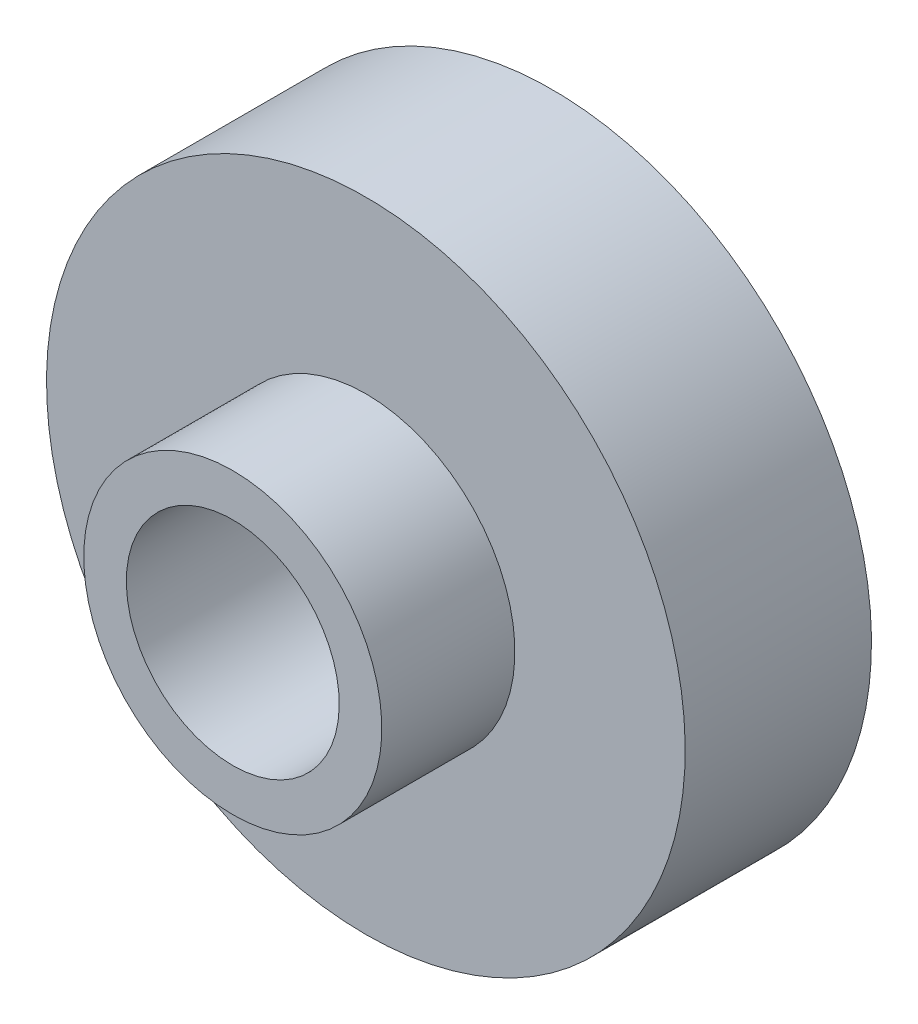
ISO-10303-21;
HEADER;
FILE_DESCRIPTION(('STEP AP214'),'2;1');
FILE_NAME('part.step','',(''),(''),'','','');
FILE_SCHEMA(('AUTOMOTIVE_DESIGN { 1 0 10303 214 1 1 1 1 }'));
ENDSEC;
DATA;
#1=APPLICATION_CONTEXT('core data for automotive mechanical design processes');
#2=APPLICATION_PROTOCOL_DEFINITION('international standard','automotive_design',2000,#1);
#3=PRODUCT_CONTEXT('',#1,'mechanical');
#4=PRODUCT('Part','Part','',(#3));
#5=PRODUCT_RELATED_PRODUCT_CATEGORY('part','',(#4));
#6=PRODUCT_DEFINITION_FORMATION('','',#4);
#7=PRODUCT_DEFINITION_CONTEXT('part definition',#1,'design');
#8=PRODUCT_DEFINITION('design','',#6,#7);
#9=PRODUCT_DEFINITION_SHAPE('','',#8);
#10=(LENGTH_UNIT() NAMED_UNIT(*) SI_UNIT(.MILLI.,.METRE.));
#11=(NAMED_UNIT(*) PLANE_ANGLE_UNIT() SI_UNIT($,.RADIAN.));
#12=(NAMED_UNIT(*) SI_UNIT($,.STERADIAN.) SOLID_ANGLE_UNIT());
#13=UNCERTAINTY_MEASURE_WITH_UNIT(LENGTH_MEASURE(1.E-05),#10,'distance_accuracy_value','');
#14=(GEOMETRIC_REPRESENTATION_CONTEXT(3) GLOBAL_UNCERTAINTY_ASSIGNED_CONTEXT((#13)) GLOBAL_UNIT_ASSIGNED_CONTEXT((#10,
#11,#12)) REPRESENTATION_CONTEXT('',''));
#15=CARTESIAN_POINT('',(0.,0.,0.));
#16=DIRECTION('',(0.,0.,1.));
#17=DIRECTION('',(1.,0.,0.));
#18=AXIS2_PLACEMENT_3D('',#15,#16,#17);
#19=CARTESIAN_POINT('',(0.,0.,152.4));
#20=DIRECTION('',(0.,0.,1.));
#21=DIRECTION('',(0.,-1.,0.));
#22=AXIS2_PLACEMENT_3D('',#19,#20,#21);
#23=CYLINDRICAL_SURFACE('',#22,50.8000000000002);
#24=CARTESIAN_POINT('',(0.,0.,66.0400000000002));
#25=DIRECTION('',(0.,0.,1.));
#26=DIRECTION('',(0.,-1.,0.));
#27=AXIS2_PLACEMENT_3D('',#24,#25,#26);
#28=CIRCLE('',#27,50.8000000000002);
#29=CARTESIAN_POINT('',(0.,-50.8000000000002,66.0400000000002));
#30=VERTEX_POINT('',#29);
#31=EDGE_CURVE('E10',#30,#30,#28,.T.);
#32=ORIENTED_EDGE('',*,*,#31,.F.);
#33=EDGE_LOOP('',(#32));
#34=FACE_BOUND('',#33,.T.);
#35=CARTESIAN_POINT('',(0.,0.,152.4));
#36=DIRECTION('',(0.,0.,1.));
#37=DIRECTION('',(0.,-1.,0.));
#38=AXIS2_PLACEMENT_3D('',#35,#36,#37);
#39=CIRCLE('',#38,50.8000000000002);
#40=CARTESIAN_POINT('',(0.,-50.8000000000002,152.4));
#41=VERTEX_POINT('',#40);
#42=EDGE_CURVE('E86',#41,#41,#39,.T.);
#43=ORIENTED_EDGE('',*,*,#42,.T.);
#44=EDGE_LOOP('',(#43));
#45=FACE_BOUND('',#44,.T.);
#46=ADVANCED_FACE('F33',(#34,#45),#23,.F.);
#47=CARTESIAN_POINT('',(0.,50.8000000000002,66.0400000000002));
#48=DIRECTION('',(0.,0.,1.));
#49=DIRECTION('',(0.,-1.,0.));
#50=AXIS2_PLACEMENT_3D('',#47,#48,#49);
#51=PLANE('',#50);
#52=CARTESIAN_POINT('',(0.,0.,66.0400000000002));
#53=DIRECTION('',(0.,0.,1.));
#54=DIRECTION('',(0.,-1.,0.));
#55=AXIS2_PLACEMENT_3D('',#52,#53,#54);
#56=CIRCLE('',#55,63.5000000000001);
#57=CARTESIAN_POINT('',(0.,-63.5000000000001,66.0400000000002));
#58=VERTEX_POINT('',#57);
#59=EDGE_CURVE('E40',#58,#58,#56,.T.);
#60=ORIENTED_EDGE('',*,*,#59,.F.);
#61=EDGE_LOOP('',(#60));
#62=FACE_BOUND('',#61,.T.);
#63=ORIENTED_EDGE('',*,*,#31,.T.);
#64=EDGE_LOOP('',(#63));
#65=FACE_BOUND('',#64,.T.);
#66=ADVANCED_FACE('F149',(#62,#65),#51,.F.);
#67=CARTESIAN_POINT('',(0.,0.,152.4));
#68=DIRECTION('',(0.,0.,1.));
#69=DIRECTION('',(0.,-1.,0.));
#70=AXIS2_PLACEMENT_3D('',#67,#68,#69);
#71=CYLINDRICAL_SURFACE('',#70,63.5000000000001);
#72=CARTESIAN_POINT('',(0.,0.,40.6400000000002));
#73=DIRECTION('',(0.,0.,1.));
#74=DIRECTION('',(0.,-1.,0.));
#75=AXIS2_PLACEMENT_3D('',#72,#73,#74);
#76=CIRCLE('',#75,63.5000000000001);
#77=CARTESIAN_POINT('',(0.,-63.5000000000001,40.6400000000002));
#78=VERTEX_POINT('',#77);
#79=EDGE_CURVE('E46',#78,#78,#76,.T.);
#80=ORIENTED_EDGE('',*,*,#79,.F.);
#81=EDGE_LOOP('',(#80));
#82=FACE_BOUND('',#81,.T.);
#83=ORIENTED_EDGE('',*,*,#59,.T.);
#84=EDGE_LOOP('',(#83));
#85=FACE_BOUND('',#84,.T.);
#86=ADVANCED_FACE('F144',(#82,#85),#71,.F.);
#87=CARTESIAN_POINT('',(0.,63.5000000000001,40.6400000000002));
#88=DIRECTION('',(0.,0.,1.));
#89=DIRECTION('',(0.,-1.,0.));
#90=AXIS2_PLACEMENT_3D('',#87,#88,#89);
#91=PLANE('',#90);
#92=CARTESIAN_POINT('',(0.,0.,40.6400000000002));
#93=DIRECTION('',(0.,0.,1.));
#94=DIRECTION('',(0.,-1.,0.));
#95=AXIS2_PLACEMENT_3D('',#92,#93,#94);
#96=CIRCLE('',#95,101.6);
#97=CARTESIAN_POINT('',(0.,-101.6,40.6400000000002));
#98=VERTEX_POINT('',#97);
#99=EDGE_CURVE('E52',#98,#98,#96,.T.);
#100=ORIENTED_EDGE('',*,*,#99,.F.);
#101=EDGE_LOOP('',(#100));
#102=FACE_BOUND('',#101,.T.);
#103=ORIENTED_EDGE('',*,*,#79,.T.);
#104=EDGE_LOOP('',(#103));
#105=FACE_BOUND('',#104,.T.);
#106=ADVANCED_FACE('F138',(#102,#105),#91,.F.);
#107=CARTESIAN_POINT('',(0.,0.,152.4));
#108=DIRECTION('',(0.,0.,1.));
#109=DIRECTION('',(0.,-1.,0.));
#110=AXIS2_PLACEMENT_3D('',#107,#108,#109);
#111=CYLINDRICAL_SURFACE('',#110,101.6);
#112=CARTESIAN_POINT('',(0.,0.,58.4200000000002));
#113=DIRECTION('',(0.,0.,1.));
#114=DIRECTION('',(0.,-1.,0.));
#115=AXIS2_PLACEMENT_3D('',#112,#113,#114);
#116=CIRCLE('',#115,101.6);
#117=CARTESIAN_POINT('',(0.,-101.6,58.4200000000002));
#118=VERTEX_POINT('',#117);
#119=EDGE_CURVE('E58',#118,#118,#116,.T.);
#120=ORIENTED_EDGE('',*,*,#119,.F.);
#121=EDGE_LOOP('',(#120));
#122=FACE_BOUND('',#121,.T.);
#123=ORIENTED_EDGE('',*,*,#99,.T.);
#124=EDGE_LOOP('',(#123));
#125=FACE_BOUND('',#124,.T.);
#126=ADVANCED_FACE('F132',(#122,#125),#111,.T.);
#127=CARTESIAN_POINT('',(0.,101.6,58.4200000000002));
#128=DIRECTION('',(0.,0.,1.));
#129=DIRECTION('',(0.,-1.,0.));
#130=AXIS2_PLACEMENT_3D('',#127,#128,#129);
#131=PLANE('',#130);
#132=CARTESIAN_POINT('',(0.,0.,58.4200000000002));
#133=DIRECTION('',(0.,0.,1.));
#134=DIRECTION('',(0.,-1.,0.));
#135=AXIS2_PLACEMENT_3D('',#132,#133,#134);
#136=CIRCLE('',#135,114.3);
#137=CARTESIAN_POINT('',(0.,-114.3,58.4200000000002));
#138=VERTEX_POINT('',#137);
#139=EDGE_CURVE('E62',#138,#138,#136,.T.);
#140=ORIENTED_EDGE('',*,*,#139,.F.);
#141=EDGE_LOOP('',(#140));
#142=FACE_BOUND('',#141,.T.);
#143=ORIENTED_EDGE('',*,*,#119,.T.);
#144=EDGE_LOOP('',(#143));
#145=FACE_BOUND('',#144,.T.);
#146=ADVANCED_FACE('F126',(#142,#145),#131,.F.);
#147=CARTESIAN_POINT('',(0.,0.,152.4));
#148=DIRECTION('',(0.,0.,1.));
#149=DIRECTION('',(0.,-1.,0.));
#150=AXIS2_PLACEMENT_3D('',#147,#148,#149);
#151=CYLINDRICAL_SURFACE('',#150,114.3);
#152=CARTESIAN_POINT('',(0.,0.,0.));
#153=DIRECTION('',(0.,0.,1.));
#154=DIRECTION('',(0.,-1.,0.));
#155=AXIS2_PLACEMENT_3D('',#152,#153,#154);
#156=CIRCLE('',#155,114.3);
#157=CARTESIAN_POINT('',(0.,-114.3,0.));
#158=VERTEX_POINT('',#157);
#159=EDGE_CURVE('E66',#158,#158,#156,.T.);
#160=ORIENTED_EDGE('',*,*,#159,.F.);
#161=EDGE_LOOP('',(#160));
#162=FACE_BOUND('',#161,.T.);
#163=ORIENTED_EDGE('',*,*,#139,.T.);
#164=EDGE_LOOP('',(#163));
#165=FACE_BOUND('',#164,.T.);
#166=ADVANCED_FACE('F120',(#162,#165),#151,.F.);
#167=CARTESIAN_POINT('',(0.,114.3,1.14581693244299E-13));
#168=DIRECTION('',(0.,0.,1.));
#169=DIRECTION('',(0.,-1.,0.));
#170=AXIS2_PLACEMENT_3D('',#167,#168,#169);
#171=PLANE('',#170);
#172=CARTESIAN_POINT('',(0.,0.,2.22044604925031E-13));
#173=DIRECTION('',(0.,0.,1.));
#174=DIRECTION('',(0.,-1.,0.));
#175=AXIS2_PLACEMENT_3D('',#172,#173,#174);
#176=CIRCLE('',#175,152.4);
#177=CARTESIAN_POINT('',(0.,-152.4,2.22044604925031E-13));
#178=VERTEX_POINT('',#177);
#179=EDGE_CURVE('E70',#178,#178,#176,.T.);
#180=ORIENTED_EDGE('',*,*,#179,.F.);
#181=EDGE_LOOP('',(#180));
#182=FACE_BOUND('',#181,.T.);
#183=ORIENTED_EDGE('',*,*,#159,.T.);
#184=EDGE_LOOP('',(#183));
#185=FACE_BOUND('',#184,.T.);
#186=ADVANCED_FACE('F114',(#182,#185),#171,.F.);
#187=CARTESIAN_POINT('',(0.,0.,152.4));
#188=DIRECTION('',(0.,0.,1.));
#189=DIRECTION('',(0.,-1.,0.));
#190=AXIS2_PLACEMENT_3D('',#187,#188,#189);
#191=CYLINDRICAL_SURFACE('',#190,152.4);
#192=CARTESIAN_POINT('',(0.,0.,88.9000000000002));
#193=DIRECTION('',(0.,0.,1.));
#194=DIRECTION('',(0.,-1.,0.));
#195=AXIS2_PLACEMENT_3D('',#192,#193,#194);
#196=CIRCLE('',#195,152.4);
#197=CARTESIAN_POINT('',(0.,-152.4,88.9000000000002));
#198=VERTEX_POINT('',#197);
#199=EDGE_CURVE('E74',#198,#198,#196,.T.);
#200=ORIENTED_EDGE('',*,*,#199,.F.);
#201=EDGE_LOOP('',(#200));
#202=FACE_BOUND('',#201,.T.);
#203=ORIENTED_EDGE('',*,*,#179,.T.);
#204=EDGE_LOOP('',(#203));
#205=FACE_BOUND('',#204,.T.);
#206=ADVANCED_FACE('F108',(#202,#205),#191,.T.);
#207=CARTESIAN_POINT('',(0.,152.4,88.9));
#208=DIRECTION('',(0.,0.,-1.));
#209=DIRECTION('',(0.,1.,0.));
#210=AXIS2_PLACEMENT_3D('',#207,#208,#209);
#211=PLANE('',#210);
#212=CARTESIAN_POINT('',(0.,0.,88.8999999999997));
#213=DIRECTION('',(0.,0.,1.));
#214=DIRECTION('',(0.,-1.,0.));
#215=AXIS2_PLACEMENT_3D('',#212,#213,#214);
#216=CIRCLE('',#215,71.12);
#217=CARTESIAN_POINT('',(0.,-71.12,88.8999999999997));
#218=VERTEX_POINT('',#217);
#219=EDGE_CURVE('E78',#218,#218,#216,.T.);
#220=ORIENTED_EDGE('',*,*,#219,.F.);
#221=EDGE_LOOP('',(#220));
#222=FACE_BOUND('',#221,.T.);
#223=ORIENTED_EDGE('',*,*,#199,.T.);
#224=EDGE_LOOP('',(#223));
#225=FACE_BOUND('',#224,.T.);
#226=ADVANCED_FACE('F102',(#222,#225),#211,.F.);
#227=CARTESIAN_POINT('',(0.,0.,152.4));
#228=DIRECTION('',(0.,0.,1.));
#229=DIRECTION('',(0.,-1.,0.));
#230=AXIS2_PLACEMENT_3D('',#227,#228,#229);
#231=CYLINDRICAL_SURFACE('',#230,71.12);
#232=CARTESIAN_POINT('',(0.,0.,152.4));
#233=DIRECTION('',(0.,0.,1.));
#234=DIRECTION('',(0.,-1.,0.));
#235=AXIS2_PLACEMENT_3D('',#232,#233,#234);
#236=CIRCLE('',#235,71.12);
#237=CARTESIAN_POINT('',(0.,-71.12,152.4));
#238=VERTEX_POINT('',#237);
#239=EDGE_CURVE('E82',#238,#238,#236,.T.);
#240=ORIENTED_EDGE('',*,*,#239,.F.);
#241=EDGE_LOOP('',(#240));
#242=FACE_BOUND('',#241,.T.);
#243=ORIENTED_EDGE('',*,*,#219,.T.);
#244=EDGE_LOOP('',(#243));
#245=FACE_BOUND('',#244,.T.);
#246=ADVANCED_FACE('F96',(#242,#245),#231,.T.);
#247=CARTESIAN_POINT('',(0.,71.12,152.4));
#248=DIRECTION('',(0.,0.,-1.));
#249=DIRECTION('',(0.,1.,0.));
#250=AXIS2_PLACEMENT_3D('',#247,#248,#249);
#251=PLANE('',#250);
#252=ORIENTED_EDGE('',*,*,#42,.F.);
#253=EDGE_LOOP('',(#252));
#254=FACE_BOUND('',#253,.T.);
#255=ORIENTED_EDGE('',*,*,#239,.T.);
#256=EDGE_LOOP('',(#255));
#257=FACE_BOUND('',#256,.T.);
#258=ADVANCED_FACE('F93',(#254,#257),#251,.F.);
#259=CLOSED_SHELL('',(#46,#66,#86,#106,#126,#146,#166,#186,#206,#226,#246,#258));
#260=MANIFOLD_SOLID_BREP('B2',#259);
#261=ADVANCED_BREP_SHAPE_REPRESENTATION('',(#18,#260),#14);
#262=SHAPE_DEFINITION_REPRESENTATION(#9,#261);
ENDSEC;
END-ISO-10303-21;
